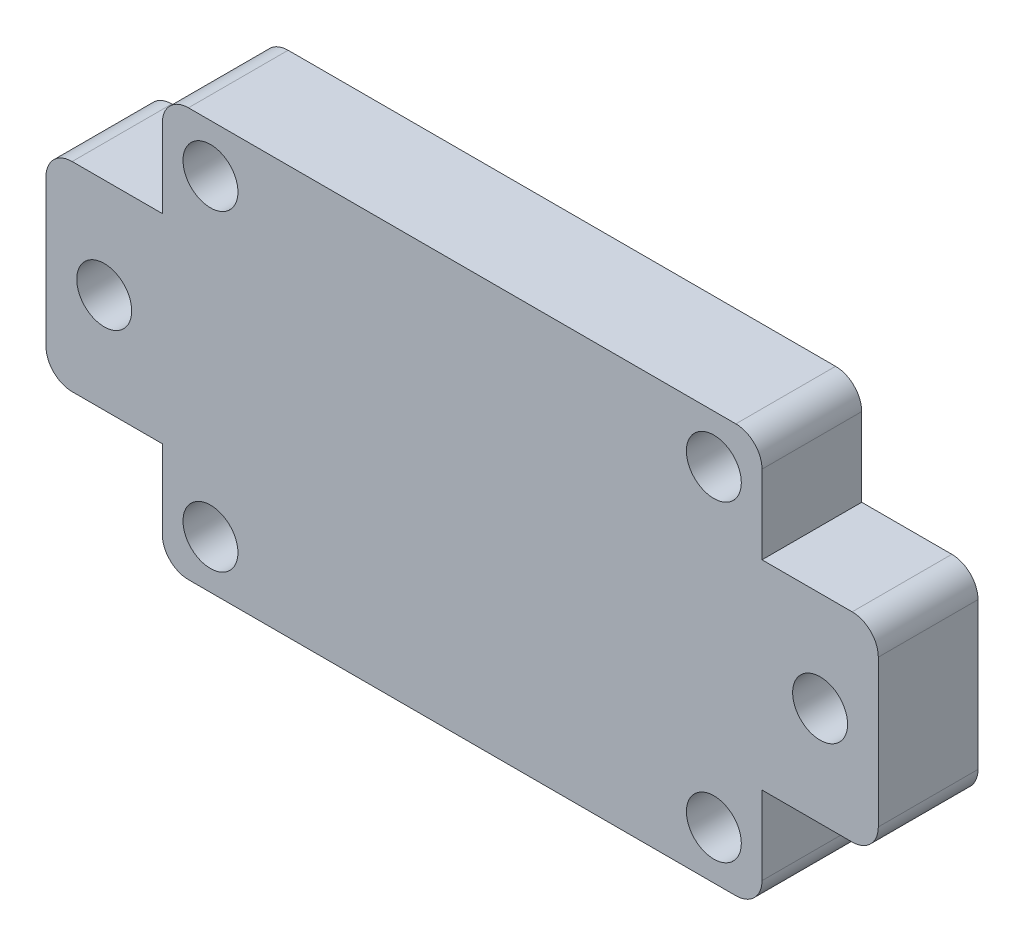
ISO-10303-21;
HEADER;
FILE_DESCRIPTION(('STEP AP214'),'2;1');
FILE_NAME('part.step','',(''),(''),'','','');
FILE_SCHEMA(('AUTOMOTIVE_DESIGN { 1 0 10303 214 1 1 1 1 }'));
ENDSEC;
DATA;
#1=APPLICATION_CONTEXT('core data for automotive mechanical design processes');
#2=APPLICATION_PROTOCOL_DEFINITION('international standard','automotive_design',2000,#1);
#3=PRODUCT_CONTEXT('',#1,'mechanical');
#4=PRODUCT('Part','Part','',(#3));
#5=PRODUCT_RELATED_PRODUCT_CATEGORY('part','',(#4));
#6=PRODUCT_DEFINITION_FORMATION('','',#4);
#7=PRODUCT_DEFINITION_CONTEXT('part definition',#1,'design');
#8=PRODUCT_DEFINITION('design','',#6,#7);
#9=PRODUCT_DEFINITION_SHAPE('','',#8);
#10=(LENGTH_UNIT() NAMED_UNIT(*) SI_UNIT(.MILLI.,.METRE.));
#11=(NAMED_UNIT(*) PLANE_ANGLE_UNIT() SI_UNIT($,.RADIAN.));
#12=(NAMED_UNIT(*) SI_UNIT($,.STERADIAN.) SOLID_ANGLE_UNIT());
#13=UNCERTAINTY_MEASURE_WITH_UNIT(LENGTH_MEASURE(1.E-05),#10,'distance_accuracy_value','');
#14=(GEOMETRIC_REPRESENTATION_CONTEXT(3) GLOBAL_UNCERTAINTY_ASSIGNED_CONTEXT((#13)) GLOBAL_UNIT_ASSIGNED_CONTEXT((#10,
#11,#12)) REPRESENTATION_CONTEXT('',''));
#15=CARTESIAN_POINT('',(0.,0.,0.));
#16=DIRECTION('',(0.,0.,1.));
#17=DIRECTION('',(1.,0.,0.));
#18=AXIS2_PLACEMENT_3D('',#15,#16,#17);
#19=CARTESIAN_POINT('',(138.811,81.915,-8.03148));
#20=DIRECTION('',(-1.,0.,0.));
#21=DIRECTION('',(0.,0.,1.));
#22=AXIS2_PLACEMENT_3D('',#19,#20,#21);
#23=PLANE('',#22);
#24=DIRECTION('',(0.,-1.,0.));
#25=VECTOR('',#24,1.);
#26=CARTESIAN_POINT('',(138.811,81.915,-8.03148));
#27=LINE('',#26,#25);
#28=CARTESIAN_POINT('',(138.811,79.915,-8.03148));
#29=VERTEX_POINT('',#28);
#30=CARTESIAN_POINT('',(138.811,73.914,-8.03148));
#31=VERTEX_POINT('',#30);
#32=EDGE_CURVE('E178',#29,#31,#27,.T.);
#33=ORIENTED_EDGE('',*,*,#32,.F.);
#34=DIRECTION('',(0.,0.,1.));
#35=VECTOR('',#34,1.);
#36=CARTESIAN_POINT('',(138.811,79.915,-8.03148));
#37=LINE('',#36,#35);
#38=CARTESIAN_POINT('',(138.811,79.915,-0.41148));
#39=VERTEX_POINT('',#38);
#40=EDGE_CURVE('E250',#29,#39,#37,.T.);
#41=ORIENTED_EDGE('',*,*,#40,.T.);
#42=DIRECTION('',(0.,-1.,0.));
#43=VECTOR('',#42,1.);
#44=CARTESIAN_POINT('',(138.811,81.915,-0.41148));
#45=LINE('',#44,#43);
#46=CARTESIAN_POINT('',(138.811,73.914,-0.41148));
#47=VERTEX_POINT('',#46);
#48=EDGE_CURVE('E202',#39,#47,#45,.T.);
#49=ORIENTED_EDGE('',*,*,#48,.T.);
#50=DIRECTION('',(0.,0.,1.));
#51=VECTOR('',#50,1.);
#52=CARTESIAN_POINT('',(138.811,73.914,-8.03148));
#53=LINE('',#52,#51);
#54=EDGE_CURVE('E196',#31,#47,#53,.T.);
#55=ORIENTED_EDGE('',*,*,#54,.F.);
#56=EDGE_LOOP('',(#33,#41,#49,#55));
#57=FACE_BOUND('',#56,.T.);
#58=ADVANCED_FACE('F41',(#57),#23,.F.);
#59=CARTESIAN_POINT('',(147.701,73.914,-8.03148));
#60=DIRECTION('',(0.,-1.,0.));
#61=DIRECTION('',(0.,0.,-1.));
#62=AXIS2_PLACEMENT_3D('',#59,#60,#61);
#63=PLANE('',#62);
#64=DIRECTION('',(1.,0.,0.));
#65=VECTOR('',#64,1.);
#66=CARTESIAN_POINT('',(147.701,73.914,-0.41148));
#67=LINE('',#66,#65);
#68=CARTESIAN_POINT('',(145.701,73.914,-0.41148));
#69=VERTEX_POINT('',#68);
#70=EDGE_CURVE('E332',#47,#69,#67,.T.);
#71=ORIENTED_EDGE('',*,*,#70,.T.);
#72=DIRECTION('',(0.,0.,1.));
#73=VECTOR('',#72,1.);
#74=CARTESIAN_POINT('',(145.701,73.914,-8.03148));
#75=LINE('',#74,#73);
#76=CARTESIAN_POINT('',(145.701,73.914,-8.03148));
#77=VERTEX_POINT('',#76);
#78=EDGE_CURVE('E198',#69,#77,#75,.F.);
#79=ORIENTED_EDGE('',*,*,#78,.T.);
#80=DIRECTION('',(1.,0.,0.));
#81=VECTOR('',#80,1.);
#82=CARTESIAN_POINT('',(147.701,73.914,-8.03148));
#83=LINE('',#82,#81);
#84=EDGE_CURVE('E182',#31,#77,#83,.T.);
#85=ORIENTED_EDGE('',*,*,#84,.F.);
#86=ORIENTED_EDGE('',*,*,#54,.T.);
#87=EDGE_LOOP('',(#71,#79,#85,#86));
#88=FACE_BOUND('',#87,.T.);
#89=ADVANCED_FACE('F195',(#88),#63,.F.);
#90=CARTESIAN_POINT('',(147.701,66.294,-8.03148));
#91=DIRECTION('',(-1.,0.,0.));
#92=DIRECTION('',(0.,0.,1.));
#93=AXIS2_PLACEMENT_3D('',#90,#91,#92);
#94=PLANE('',#93);
#95=DIRECTION('',(0.,-1.,0.));
#96=VECTOR('',#95,1.);
#97=CARTESIAN_POINT('',(147.701,66.294,-0.41148));
#98=LINE('',#97,#96);
#99=CARTESIAN_POINT('',(147.701,71.914,-0.41148));
#100=VERTEX_POINT('',#99);
#101=CARTESIAN_POINT('',(147.701,60.674,-0.41148));
#102=VERTEX_POINT('',#101);
#103=EDGE_CURVE('E335',#100,#102,#98,.T.);
#104=ORIENTED_EDGE('',*,*,#103,.T.);
#105=DIRECTION('',(0.,0.,1.));
#106=VECTOR('',#105,1.);
#107=CARTESIAN_POINT('',(147.701,60.674,-8.03148));
#108=LINE('',#107,#106);
#109=CARTESIAN_POINT('',(147.701,60.674,-8.03148));
#110=VERTEX_POINT('',#109);
#111=EDGE_CURVE('E233',#102,#110,#108,.F.);
#112=ORIENTED_EDGE('',*,*,#111,.T.);
#113=DIRECTION('',(0.,-1.,0.));
#114=VECTOR('',#113,1.);
#115=CARTESIAN_POINT('',(147.701,66.294,-8.03148));
#116=LINE('',#115,#114);
#117=CARTESIAN_POINT('',(147.701,71.914,-8.03148));
#118=VERTEX_POINT('',#117);
#119=EDGE_CURVE('E199',#118,#110,#116,.T.);
#120=ORIENTED_EDGE('',*,*,#119,.F.);
#121=DIRECTION('',(0.,0.,1.));
#122=VECTOR('',#121,1.);
#123=CARTESIAN_POINT('',(147.701,71.914,-8.03148));
#124=LINE('',#123,#122);
#125=EDGE_CURVE('E230',#118,#100,#124,.T.);
#126=ORIENTED_EDGE('',*,*,#125,.T.);
#127=EDGE_LOOP('',(#104,#112,#120,#126));
#128=FACE_BOUND('',#127,.T.);
#129=ADVANCED_FACE('F429',(#128),#94,.F.);
#130=CARTESIAN_POINT('',(147.701,58.674,-8.03148));
#131=DIRECTION('',(0.,1.,0.));
#132=DIRECTION('',(0.,0.,1.));
#133=AXIS2_PLACEMENT_3D('',#130,#131,#132);
#134=PLANE('',#133);
#135=DIRECTION('',(-1.,0.,0.));
#136=VECTOR('',#135,1.);
#137=CARTESIAN_POINT('',(147.701,58.674,-8.03148));
#138=LINE('',#137,#136);
#139=CARTESIAN_POINT('',(145.701,58.674,-8.03148));
#140=VERTEX_POINT('',#139);
#141=CARTESIAN_POINT('',(138.811,58.674,-8.03148));
#142=VERTEX_POINT('',#141);
#143=EDGE_CURVE('E357',#140,#142,#138,.T.);
#144=ORIENTED_EDGE('',*,*,#143,.F.);
#145=DIRECTION('',(0.,0.,1.));
#146=VECTOR('',#145,1.);
#147=CARTESIAN_POINT('',(145.701,58.674,-8.03148));
#148=LINE('',#147,#146);
#149=CARTESIAN_POINT('',(145.701,58.674,-0.41148));
#150=VERTEX_POINT('',#149);
#151=EDGE_CURVE('E204',#140,#150,#148,.T.);
#152=ORIENTED_EDGE('',*,*,#151,.T.);
#153=DIRECTION('',(-1.,0.,0.));
#154=VECTOR('',#153,1.);
#155=CARTESIAN_POINT('',(147.701,58.674,-0.41148));
#156=LINE('',#155,#154);
#157=CARTESIAN_POINT('',(138.811,58.674,-0.41148));
#158=VERTEX_POINT('',#157);
#159=EDGE_CURVE('E338',#150,#158,#156,.T.);
#160=ORIENTED_EDGE('',*,*,#159,.T.);
#161=DIRECTION('',(0.,0.,1.));
#162=VECTOR('',#161,1.);
#163=CARTESIAN_POINT('',(138.811,58.674,-8.03148));
#164=LINE('',#163,#162);
#165=EDGE_CURVE('E205',#142,#158,#164,.T.);
#166=ORIENTED_EDGE('',*,*,#165,.F.);
#167=EDGE_LOOP('',(#144,#152,#160,#166));
#168=FACE_BOUND('',#167,.T.);
#169=ADVANCED_FACE('F493',(#168),#134,.F.);
#170=CARTESIAN_POINT('',(138.811,58.674,-8.03148));
#171=DIRECTION('',(-1.,0.,0.));
#172=DIRECTION('',(0.,0.,1.));
#173=AXIS2_PLACEMENT_3D('',#170,#171,#172);
#174=PLANE('',#173);
#175=DIRECTION('',(0.,-1.,0.));
#176=VECTOR('',#175,1.);
#177=CARTESIAN_POINT('',(138.811,58.674,-0.41148));
#178=LINE('',#177,#176);
#179=CARTESIAN_POINT('',(138.811,52.673,-0.41148));
#180=VERTEX_POINT('',#179);
#181=EDGE_CURVE('E296',#158,#180,#178,.T.);
#182=ORIENTED_EDGE('',*,*,#181,.T.);
#183=DIRECTION('',(0.,0.,1.));
#184=VECTOR('',#183,1.);
#185=CARTESIAN_POINT('',(138.811,52.673,-8.03148));
#186=LINE('',#185,#184);
#187=CARTESIAN_POINT('',(138.811,52.673,-8.03148));
#188=VERTEX_POINT('',#187);
#189=EDGE_CURVE('E261',#180,#188,#186,.F.);
#190=ORIENTED_EDGE('',*,*,#189,.T.);
#191=DIRECTION('',(0.,-1.,0.));
#192=VECTOR('',#191,1.);
#193=CARTESIAN_POINT('',(138.811,58.674,-8.03148));
#194=LINE('',#193,#192);
#195=EDGE_CURVE('E353',#142,#188,#194,.T.);
#196=ORIENTED_EDGE('',*,*,#195,.F.);
#197=ORIENTED_EDGE('',*,*,#165,.T.);
#198=EDGE_LOOP('',(#182,#190,#196,#197));
#199=FACE_BOUND('',#198,.T.);
#200=ADVANCED_FACE('F343',(#199),#174,.F.);
#201=CARTESIAN_POINT('',(138.811,50.673,-8.03148));
#202=DIRECTION('',(0.,1.,0.));
#203=DIRECTION('',(0.,0.,1.));
#204=AXIS2_PLACEMENT_3D('',#201,#202,#203);
#205=PLANE('',#204);
#206=DIRECTION('',(-1.,0.,0.));
#207=VECTOR('',#206,1.);
#208=CARTESIAN_POINT('',(138.811,50.673,-8.03148));
#209=LINE('',#208,#207);
#210=CARTESIAN_POINT('',(136.811,50.673,-8.03148));
#211=VERTEX_POINT('',#210);
#212=CARTESIAN_POINT('',(94.964,50.673,-8.03148));
#213=VERTEX_POINT('',#212);
#214=EDGE_CURVE('E323',#211,#213,#209,.T.);
#215=ORIENTED_EDGE('',*,*,#214,.F.);
#216=DIRECTION('',(0.,0.,1.));
#217=VECTOR('',#216,1.);
#218=CARTESIAN_POINT('',(136.811,50.673,-8.03148));
#219=LINE('',#218,#217);
#220=CARTESIAN_POINT('',(136.811,50.673,-0.41148));
#221=VERTEX_POINT('',#220);
#222=EDGE_CURVE('E258',#211,#221,#219,.T.);
#223=ORIENTED_EDGE('',*,*,#222,.T.);
#224=DIRECTION('',(-1.,0.,0.));
#225=VECTOR('',#224,1.);
#226=CARTESIAN_POINT('',(138.811,50.673,-0.41148));
#227=LINE('',#226,#225);
#228=CARTESIAN_POINT('',(94.964,50.673,-0.41148));
#229=VERTEX_POINT('',#228);
#230=EDGE_CURVE('E292',#221,#229,#227,.T.);
#231=ORIENTED_EDGE('',*,*,#230,.T.);
#232=DIRECTION('',(0.,0.,1.));
#233=VECTOR('',#232,1.);
#234=CARTESIAN_POINT('',(94.964,50.673,-8.03148));
#235=LINE('',#234,#233);
#236=EDGE_CURVE('E256',#229,#213,#235,.F.);
#237=ORIENTED_EDGE('',*,*,#236,.T.);
#238=EDGE_LOOP('',(#215,#223,#231,#237));
#239=FACE_BOUND('',#238,.T.);
#240=ADVANCED_FACE('F355',(#239),#205,.F.);
#241=CARTESIAN_POINT('',(92.964,58.674,-8.03148));
#242=DIRECTION('',(1.,0.,0.));
#243=DIRECTION('',(0.,1.,0.));
#244=AXIS2_PLACEMENT_3D('',#241,#242,#243);
#245=PLANE('',#244);
#246=DIRECTION('',(0.,1.,0.));
#247=VECTOR('',#246,1.);
#248=CARTESIAN_POINT('',(92.964,58.674,-8.03148));
#249=LINE('',#248,#247);
#250=CARTESIAN_POINT('',(92.964,52.673,-8.03148));
#251=VERTEX_POINT('',#250);
#252=CARTESIAN_POINT('',(92.964,58.674,-8.03148));
#253=VERTEX_POINT('',#252);
#254=EDGE_CURVE('E281',#251,#253,#249,.T.);
#255=ORIENTED_EDGE('',*,*,#254,.F.);
#256=DIRECTION('',(0.,0.,1.));
#257=VECTOR('',#256,1.);
#258=CARTESIAN_POINT('',(92.964,52.673,-8.03148));
#259=LINE('',#258,#257);
#260=CARTESIAN_POINT('',(92.964,52.673,-0.41148));
#261=VERTEX_POINT('',#260);
#262=EDGE_CURVE('E49',#251,#261,#259,.T.);
#263=ORIENTED_EDGE('',*,*,#262,.T.);
#264=DIRECTION('',(0.,1.,0.));
#265=VECTOR('',#264,1.);
#266=CARTESIAN_POINT('',(92.964,58.674,-0.41148));
#267=LINE('',#266,#265);
#268=CARTESIAN_POINT('',(92.964,58.674,-0.41148));
#269=VERTEX_POINT('',#268);
#270=EDGE_CURVE('E279',#261,#269,#267,.T.);
#271=ORIENTED_EDGE('',*,*,#270,.T.);
#272=DIRECTION('',(0.,0.,1.));
#273=VECTOR('',#272,1.);
#274=CARTESIAN_POINT('',(92.964,58.674,-8.03148));
#275=LINE('',#274,#273);
#276=EDGE_CURVE('E211',#253,#269,#275,.T.);
#277=ORIENTED_EDGE('',*,*,#276,.F.);
#278=EDGE_LOOP('',(#255,#263,#271,#277));
#279=FACE_BOUND('',#278,.T.);
#280=ADVANCED_FACE('F277',(#279),#245,.F.);
#281=CARTESIAN_POINT('',(84.074,58.674,-8.03148));
#282=DIRECTION('',(0.,1.,0.));
#283=DIRECTION('',(0.,0.,1.));
#284=AXIS2_PLACEMENT_3D('',#281,#282,#283);
#285=PLANE('',#284);
#286=DIRECTION('',(-1.,0.,0.));
#287=VECTOR('',#286,1.);
#288=CARTESIAN_POINT('',(84.074,58.674,-0.41148));
#289=LINE('',#288,#287);
#290=CARTESIAN_POINT('',(86.074,58.674,-0.41148));
#291=VERTEX_POINT('',#290);
#292=EDGE_CURVE('E291',#269,#291,#289,.T.);
#293=ORIENTED_EDGE('',*,*,#292,.T.);
#294=DIRECTION('',(0.,0.,1.));
#295=VECTOR('',#294,1.);
#296=CARTESIAN_POINT('',(86.074,58.674,-8.03148));
#297=LINE('',#296,#295);
#298=CARTESIAN_POINT('',(86.074,58.674,-8.03148));
#299=VERTEX_POINT('',#298);
#300=EDGE_CURVE('E11',#291,#299,#297,.F.);
#301=ORIENTED_EDGE('',*,*,#300,.T.);
#302=DIRECTION('',(-1.,0.,0.));
#303=VECTOR('',#302,1.);
#304=CARTESIAN_POINT('',(84.074,58.674,-8.03148));
#305=LINE('',#304,#303);
#306=EDGE_CURVE('E316',#253,#299,#305,.T.);
#307=ORIENTED_EDGE('',*,*,#306,.F.);
#308=ORIENTED_EDGE('',*,*,#276,.T.);
#309=EDGE_LOOP('',(#293,#301,#307,#308));
#310=FACE_BOUND('',#309,.T.);
#311=ADVANCED_FACE('F313',(#310),#285,.F.);
#312=CARTESIAN_POINT('',(84.074,66.294,-8.03148));
#313=DIRECTION('',(1.,0.,0.));
#314=DIRECTION('',(0.,0.,-1.));
#315=AXIS2_PLACEMENT_3D('',#312,#313,#314);
#316=PLANE('',#315);
#317=DIRECTION('',(0.,1.,0.));
#318=VECTOR('',#317,1.);
#319=CARTESIAN_POINT('',(84.074,66.294,-0.41148));
#320=LINE('',#319,#318);
#321=CARTESIAN_POINT('',(84.074,60.674,-0.41148));
#322=VERTEX_POINT('',#321);
#323=CARTESIAN_POINT('',(84.074,71.914,-0.41148));
#324=VERTEX_POINT('',#323);
#325=EDGE_CURVE('E294',#322,#324,#320,.T.);
#326=ORIENTED_EDGE('',*,*,#325,.T.);
#327=DIRECTION('',(0.,0.,1.));
#328=VECTOR('',#327,1.);
#329=CARTESIAN_POINT('',(84.074,71.914,-8.03148));
#330=LINE('',#329,#328);
#331=CARTESIAN_POINT('',(84.074,71.914,-8.03148));
#332=VERTEX_POINT('',#331);
#333=EDGE_CURVE('E271',#324,#332,#330,.F.);
#334=ORIENTED_EDGE('',*,*,#333,.T.);
#335=DIRECTION('',(0.,1.,0.));
#336=VECTOR('',#335,1.);
#337=CARTESIAN_POINT('',(84.074,66.294,-8.03148));
#338=LINE('',#337,#336);
#339=CARTESIAN_POINT('',(84.074,60.674,-8.03148));
#340=VERTEX_POINT('',#339);
#341=EDGE_CURVE('E318',#340,#332,#338,.T.);
#342=ORIENTED_EDGE('',*,*,#341,.F.);
#343=DIRECTION('',(0.,0.,1.));
#344=VECTOR('',#343,1.);
#345=CARTESIAN_POINT('',(84.074,60.674,-8.03148));
#346=LINE('',#345,#344);
#347=EDGE_CURVE('E268',#340,#322,#346,.T.);
#348=ORIENTED_EDGE('',*,*,#347,.T.);
#349=EDGE_LOOP('',(#326,#334,#342,#348));
#350=FACE_BOUND('',#349,.T.);
#351=ADVANCED_FACE('F467',(#350),#316,.F.);
#352=CARTESIAN_POINT('',(84.074,73.914,-8.03148));
#353=DIRECTION('',(0.,-1.,0.));
#354=DIRECTION('',(0.,0.,-1.));
#355=AXIS2_PLACEMENT_3D('',#352,#353,#354);
#356=PLANE('',#355);
#357=DIRECTION('',(1.,0.,0.));
#358=VECTOR('',#357,1.);
#359=CARTESIAN_POINT('',(84.074,73.914,-8.03148));
#360=LINE('',#359,#358);
#361=CARTESIAN_POINT('',(86.074,73.914,-8.03148));
#362=VERTEX_POINT('',#361);
#363=CARTESIAN_POINT('',(92.964,73.914,-8.03148));
#364=VERTEX_POINT('',#363);
#365=EDGE_CURVE('E321',#362,#364,#360,.T.);
#366=ORIENTED_EDGE('',*,*,#365,.F.);
#367=DIRECTION('',(0.,0.,1.));
#368=VECTOR('',#367,1.);
#369=CARTESIAN_POINT('',(86.074,73.914,-8.03148));
#370=LINE('',#369,#368);
#371=CARTESIAN_POINT('',(86.074,73.914,-0.41148));
#372=VERTEX_POINT('',#371);
#373=EDGE_CURVE('E265',#362,#372,#370,.T.);
#374=ORIENTED_EDGE('',*,*,#373,.T.);
#375=DIRECTION('',(1.,0.,0.));
#376=VECTOR('',#375,1.);
#377=CARTESIAN_POINT('',(84.074,73.914,-0.41148));
#378=LINE('',#377,#376);
#379=CARTESIAN_POINT('',(92.964,73.914,-0.41148));
#380=VERTEX_POINT('',#379);
#381=EDGE_CURVE('E302',#372,#380,#378,.T.);
#382=ORIENTED_EDGE('',*,*,#381,.T.);
#383=DIRECTION('',(0.,0.,1.));
#384=VECTOR('',#383,1.);
#385=CARTESIAN_POINT('',(92.964,73.914,-8.03148));
#386=LINE('',#385,#384);
#387=EDGE_CURVE('E308',#364,#380,#386,.T.);
#388=ORIENTED_EDGE('',*,*,#387,.F.);
#389=EDGE_LOOP('',(#366,#374,#382,#388));
#390=FACE_BOUND('',#389,.T.);
#391=ADVANCED_FACE('F474',(#390),#356,.F.);
#392=CARTESIAN_POINT('',(92.964,81.915,-8.03148));
#393=DIRECTION('',(1.,0.,0.));
#394=DIRECTION('',(0.,1.,0.));
#395=AXIS2_PLACEMENT_3D('',#392,#393,#394);
#396=PLANE('',#395);
#397=DIRECTION('',(0.,1.,0.));
#398=VECTOR('',#397,1.);
#399=CARTESIAN_POINT('',(92.964,81.915,-0.41148));
#400=LINE('',#399,#398);
#401=CARTESIAN_POINT('',(92.964,79.915,-0.41148));
#402=VERTEX_POINT('',#401);
#403=EDGE_CURVE('E304',#380,#402,#400,.T.);
#404=ORIENTED_EDGE('',*,*,#403,.T.);
#405=DIRECTION('',(0.,0.,1.));
#406=VECTOR('',#405,1.);
#407=CARTESIAN_POINT('',(92.964,79.915,-8.03148));
#408=LINE('',#407,#406);
#409=CARTESIAN_POINT('',(92.964,79.915,-8.03148));
#410=VERTEX_POINT('',#409);
#411=EDGE_CURVE('E263',#402,#410,#408,.F.);
#412=ORIENTED_EDGE('',*,*,#411,.T.);
#413=DIRECTION('',(0.,1.,0.));
#414=VECTOR('',#413,1.);
#415=CARTESIAN_POINT('',(92.964,81.915,-8.03148));
#416=LINE('',#415,#414);
#417=EDGE_CURVE('E328',#364,#410,#416,.T.);
#418=ORIENTED_EDGE('',*,*,#417,.F.);
#419=ORIENTED_EDGE('',*,*,#387,.T.);
#420=EDGE_LOOP('',(#404,#412,#418,#419));
#421=FACE_BOUND('',#420,.T.);
#422=ADVANCED_FACE('F479',(#421),#396,.F.);
#423=CARTESIAN_POINT('',(138.811,81.915,-8.03148));
#424=DIRECTION('',(0.,-1.,0.));
#425=DIRECTION('',(0.,0.,-1.));
#426=AXIS2_PLACEMENT_3D('',#423,#424,#425);
#427=PLANE('',#426);
#428=DIRECTION('',(1.,0.,0.));
#429=VECTOR('',#428,1.);
#430=CARTESIAN_POINT('',(138.811,81.915,-0.41148));
#431=LINE('',#430,#429);
#432=CARTESIAN_POINT('',(94.964,81.915,-0.41148));
#433=VERTEX_POINT('',#432);
#434=CARTESIAN_POINT('',(136.811,81.915,-0.41148));
#435=VERTEX_POINT('',#434);
#436=EDGE_CURVE('E190',#433,#435,#431,.T.);
#437=ORIENTED_EDGE('',*,*,#436,.T.);
#438=DIRECTION('',(0.,0.,1.));
#439=VECTOR('',#438,1.);
#440=CARTESIAN_POINT('',(136.811,81.915,-8.03148));
#441=LINE('',#440,#439);
#442=CARTESIAN_POINT('',(136.811,81.915,-8.03148));
#443=VERTEX_POINT('',#442);
#444=EDGE_CURVE('E56',#435,#443,#441,.F.);
#445=ORIENTED_EDGE('',*,*,#444,.T.);
#446=DIRECTION('',(1.,0.,0.));
#447=VECTOR('',#446,1.);
#448=CARTESIAN_POINT('',(138.811,81.915,-8.03148));
#449=LINE('',#448,#447);
#450=CARTESIAN_POINT('',(94.964,81.915,-8.03148));
#451=VERTEX_POINT('',#450);
#452=EDGE_CURVE('E310',#451,#443,#449,.T.);
#453=ORIENTED_EDGE('',*,*,#452,.F.);
#454=DIRECTION('',(0.,0.,1.));
#455=VECTOR('',#454,1.);
#456=CARTESIAN_POINT('',(94.964,81.915,-8.03148));
#457=LINE('',#456,#455);
#458=EDGE_CURVE('E252',#451,#433,#457,.T.);
#459=ORIENTED_EDGE('',*,*,#458,.T.);
#460=EDGE_LOOP('',(#437,#445,#453,#459));
#461=FACE_BOUND('',#460,.T.);
#462=ADVANCED_FACE('F483',(#461),#427,.F.);
#463=CARTESIAN_POINT('',(0.,0.,-8.03148));
#464=DIRECTION('',(0.,0.,-1.));
#465=DIRECTION('',(-1.,0.,0.));
#466=AXIS2_PLACEMENT_3D('',#463,#464,#465);
#467=PLANE('',#466);
#468=CARTESIAN_POINT('',(88.524,66.294,-8.03148));
#469=DIRECTION('',(0.,0.,1.));
#470=DIRECTION('',(1.,0.,0.));
#471=AXIS2_PLACEMENT_3D('',#468,#469,#470);
#472=CIRCLE('',#471,2.09999999099999);
#473=CARTESIAN_POINT('',(90.623999991,66.294,-8.03148));
#474=VERTEX_POINT('',#473);
#475=EDGE_CURVE('E333',#474,#474,#472,.T.);
#476=ORIENTED_EDGE('',*,*,#475,.T.);
#477=EDGE_LOOP('',(#476));
#478=FACE_BOUND('',#477,.T.);
#479=CARTESIAN_POINT('',(143.251,66.294,-8.03148));
#480=DIRECTION('',(0.,0.,1.));
#481=DIRECTION('',(1.,0.,0.));
#482=AXIS2_PLACEMENT_3D('',#479,#480,#481);
#483=CIRCLE('',#482,2.09999999999999);
#484=CARTESIAN_POINT('',(145.351,66.294,-8.03148));
#485=VERTEX_POINT('',#484);
#486=EDGE_CURVE('E365',#485,#485,#483,.T.);
#487=ORIENTED_EDGE('',*,*,#486,.T.);
#488=EDGE_LOOP('',(#487));
#489=FACE_BOUND('',#488,.T.);
#490=ORIENTED_EDGE('',*,*,#119,.T.);
#491=CARTESIAN_POINT('',(145.701,60.674,-8.03148));
#492=DIRECTION('',(0.,0.,-1.));
#493=DIRECTION('',(-1.,0.,0.));
#494=AXIS2_PLACEMENT_3D('',#491,#492,#493);
#495=CIRCLE('',#494,2.);
#496=EDGE_CURVE('E247',#110,#140,#495,.T.);
#497=ORIENTED_EDGE('',*,*,#496,.T.);
#498=ORIENTED_EDGE('',*,*,#143,.T.);
#499=ORIENTED_EDGE('',*,*,#195,.T.);
#500=CARTESIAN_POINT('',(136.811,52.673,-8.03148));
#501=DIRECTION('',(0.,0.,-1.));
#502=DIRECTION('',(-1.,0.,0.));
#503=AXIS2_PLACEMENT_3D('',#500,#501,#502);
#504=CIRCLE('',#503,2.);
#505=EDGE_CURVE('E242',#188,#211,#504,.T.);
#506=ORIENTED_EDGE('',*,*,#505,.T.);
#507=ORIENTED_EDGE('',*,*,#214,.T.);
#508=CARTESIAN_POINT('',(94.964,52.673,-8.03148));
#509=DIRECTION('',(0.,0.,-1.));
#510=DIRECTION('',(-1.,0.,0.));
#511=AXIS2_PLACEMENT_3D('',#508,#509,#510);
#512=CIRCLE('',#511,2.);
#513=EDGE_CURVE('E237',#213,#251,#512,.T.);
#514=ORIENTED_EDGE('',*,*,#513,.T.);
#515=ORIENTED_EDGE('',*,*,#254,.T.);
#516=ORIENTED_EDGE('',*,*,#306,.T.);
#517=CARTESIAN_POINT('',(86.074,60.674,-8.03148));
#518=DIRECTION('',(0.,0.,-1.));
#519=DIRECTION('',(-1.,0.,0.));
#520=AXIS2_PLACEMENT_3D('',#517,#518,#519);
#521=CIRCLE('',#520,2.);
#522=EDGE_CURVE('E235',#299,#340,#521,.T.);
#523=ORIENTED_EDGE('',*,*,#522,.T.);
#524=ORIENTED_EDGE('',*,*,#341,.T.);
#525=CARTESIAN_POINT('',(86.074,71.914,-8.03148));
#526=DIRECTION('',(0.,0.,-1.));
#527=DIRECTION('',(-1.,0.,0.));
#528=AXIS2_PLACEMENT_3D('',#525,#526,#527);
#529=CIRCLE('',#528,2.);
#530=EDGE_CURVE('E239',#332,#362,#529,.T.);
#531=ORIENTED_EDGE('',*,*,#530,.T.);
#532=ORIENTED_EDGE('',*,*,#365,.T.);
#533=ORIENTED_EDGE('',*,*,#417,.T.);
#534=CARTESIAN_POINT('',(94.964,79.915,-8.03148));
#535=DIRECTION('',(0.,0.,-1.));
#536=DIRECTION('',(-1.,0.,0.));
#537=AXIS2_PLACEMENT_3D('',#534,#535,#536);
#538=CIRCLE('',#537,2.);
#539=EDGE_CURVE('E63',#410,#451,#538,.T.);
#540=ORIENTED_EDGE('',*,*,#539,.T.);
#541=ORIENTED_EDGE('',*,*,#452,.T.);
#542=CARTESIAN_POINT('',(136.811,79.915,-8.03148));
#543=DIRECTION('',(0.,0.,-1.));
#544=DIRECTION('',(-1.,0.,0.));
#545=AXIS2_PLACEMENT_3D('',#542,#543,#544);
#546=CIRCLE('',#545,2.);
#547=EDGE_CURVE('E185',#443,#29,#546,.T.);
#548=ORIENTED_EDGE('',*,*,#547,.T.);
#549=ORIENTED_EDGE('',*,*,#32,.T.);
#550=ORIENTED_EDGE('',*,*,#84,.T.);
#551=CARTESIAN_POINT('',(145.701,71.914,-8.03148));
#552=DIRECTION('',(0.,0.,-1.));
#553=DIRECTION('',(-1.,0.,0.));
#554=AXIS2_PLACEMENT_3D('',#551,#552,#553);
#555=CIRCLE('',#554,2.);
#556=EDGE_CURVE('E245',#77,#118,#555,.T.);
#557=ORIENTED_EDGE('',*,*,#556,.T.);
#558=EDGE_LOOP('',(#490,#497,#498,#499,#506,#507,#514,#515,#516,#523,#524,#531,#532,#533,#540,
#541,#548,#549,#550,#557));
#559=FACE_BOUND('',#558,.T.);
#560=ADVANCED_FACE('F181',(#478,#489,#559),#467,.T.);
#561=CARTESIAN_POINT('',(0.,0.,-0.41148));
#562=DIRECTION('',(0.,0.,-1.));
#563=DIRECTION('',(-1.,0.,0.));
#564=AXIS2_PLACEMENT_3D('',#561,#562,#563);
#565=PLANE('',#564);
#566=CARTESIAN_POINT('',(135.128,78.232,-0.41148));
#567=DIRECTION('',(0.,0.,1.));
#568=DIRECTION('',(1.,0.,0.));
#569=AXIS2_PLACEMENT_3D('',#566,#567,#568);
#570=CIRCLE('',#569,2.09999999999999);
#571=CARTESIAN_POINT('',(137.228,78.232,-0.41148));
#572=VERTEX_POINT('',#571);
#573=EDGE_CURVE('E383',#572,#572,#570,.T.);
#574=ORIENTED_EDGE('',*,*,#573,.F.);
#575=EDGE_LOOP('',(#574));
#576=FACE_BOUND('',#575,.T.);
#577=CARTESIAN_POINT('',(135.128,54.356,-0.41148));
#578=DIRECTION('',(0.,0.,1.));
#579=DIRECTION('',(1.,0.,0.));
#580=AXIS2_PLACEMENT_3D('',#577,#578,#579);
#581=CIRCLE('',#580,2.09999999999999);
#582=CARTESIAN_POINT('',(137.228,54.356,-0.41148));
#583=VERTEX_POINT('',#582);
#584=EDGE_CURVE('E389',#583,#583,#581,.T.);
#585=ORIENTED_EDGE('',*,*,#584,.F.);
#586=EDGE_LOOP('',(#585));
#587=FACE_BOUND('',#586,.T.);
#588=CARTESIAN_POINT('',(96.647,54.356,-0.41148));
#589=DIRECTION('',(0.,0.,1.));
#590=DIRECTION('',(1.,0.,0.));
#591=AXIS2_PLACEMENT_3D('',#588,#589,#590);
#592=CIRCLE('',#591,2.1);
#593=CARTESIAN_POINT('',(98.747,54.356,-0.41148));
#594=VERTEX_POINT('',#593);
#595=EDGE_CURVE('E377',#594,#594,#592,.T.);
#596=ORIENTED_EDGE('',*,*,#595,.F.);
#597=EDGE_LOOP('',(#596));
#598=FACE_BOUND('',#597,.T.);
#599=CARTESIAN_POINT('',(96.647,78.232,-0.41148));
#600=DIRECTION('',(0.,0.,1.));
#601=DIRECTION('',(1.,0.,0.));
#602=AXIS2_PLACEMENT_3D('',#599,#600,#601);
#603=CIRCLE('',#602,2.1);
#604=CARTESIAN_POINT('',(98.747,78.232,-0.41148));
#605=VERTEX_POINT('',#604);
#606=EDGE_CURVE('E374',#605,#605,#603,.T.);
#607=ORIENTED_EDGE('',*,*,#606,.F.);
#608=EDGE_LOOP('',(#607));
#609=FACE_BOUND('',#608,.T.);
#610=CARTESIAN_POINT('',(88.524,66.294,-0.41148));
#611=DIRECTION('',(0.,0.,1.));
#612=DIRECTION('',(1.,0.,0.));
#613=AXIS2_PLACEMENT_3D('',#610,#611,#612);
#614=CIRCLE('',#613,2.09999999099999);
#615=CARTESIAN_POINT('',(90.623999991,66.294,-0.41148));
#616=VERTEX_POINT('',#615);
#617=EDGE_CURVE('E369',#616,#616,#614,.T.);
#618=ORIENTED_EDGE('',*,*,#617,.F.);
#619=EDGE_LOOP('',(#618));
#620=FACE_BOUND('',#619,.T.);
#621=CARTESIAN_POINT('',(143.251,66.294,-0.41148));
#622=DIRECTION('',(0.,0.,1.));
#623=DIRECTION('',(1.,0.,0.));
#624=AXIS2_PLACEMENT_3D('',#621,#622,#623);
#625=CIRCLE('',#624,2.09999999999999);
#626=CARTESIAN_POINT('',(145.351,66.294,-0.41148));
#627=VERTEX_POINT('',#626);
#628=EDGE_CURVE('E362',#627,#627,#625,.T.);
#629=ORIENTED_EDGE('',*,*,#628,.F.);
#630=EDGE_LOOP('',(#629));
#631=FACE_BOUND('',#630,.T.);
#632=ORIENTED_EDGE('',*,*,#159,.F.);
#633=CARTESIAN_POINT('',(145.701,60.674,-0.41148));
#634=DIRECTION('',(0.,0.,-1.));
#635=DIRECTION('',(-1.,0.,0.));
#636=AXIS2_PLACEMENT_3D('',#633,#634,#635);
#637=CIRCLE('',#636,2.);
#638=EDGE_CURVE('E228',#150,#102,#637,.F.);
#639=ORIENTED_EDGE('',*,*,#638,.T.);
#640=ORIENTED_EDGE('',*,*,#103,.F.);
#641=CARTESIAN_POINT('',(145.701,71.914,-0.41148));
#642=DIRECTION('',(0.,0.,-1.));
#643=DIRECTION('',(-1.,0.,0.));
#644=AXIS2_PLACEMENT_3D('',#641,#642,#643);
#645=CIRCLE('',#644,2.);
#646=EDGE_CURVE('E226',#100,#69,#645,.F.);
#647=ORIENTED_EDGE('',*,*,#646,.T.);
#648=ORIENTED_EDGE('',*,*,#70,.F.);
#649=ORIENTED_EDGE('',*,*,#48,.F.);
#650=CARTESIAN_POINT('',(136.811,79.915,-0.41148));
#651=DIRECTION('',(0.,0.,-1.));
#652=DIRECTION('',(-1.,0.,0.));
#653=AXIS2_PLACEMENT_3D('',#650,#651,#652);
#654=CIRCLE('',#653,2.);
#655=EDGE_CURVE('E224',#39,#435,#654,.F.);
#656=ORIENTED_EDGE('',*,*,#655,.T.);
#657=ORIENTED_EDGE('',*,*,#436,.F.);
#658=CARTESIAN_POINT('',(94.964,79.915,-0.41148));
#659=DIRECTION('',(0.,0.,-1.));
#660=DIRECTION('',(-1.,0.,0.));
#661=AXIS2_PLACEMENT_3D('',#658,#659,#660);
#662=CIRCLE('',#661,2.);
#663=EDGE_CURVE('E220',#433,#402,#662,.F.);
#664=ORIENTED_EDGE('',*,*,#663,.T.);
#665=ORIENTED_EDGE('',*,*,#403,.F.);
#666=ORIENTED_EDGE('',*,*,#381,.F.);
#667=CARTESIAN_POINT('',(86.074,71.914,-0.41148));
#668=DIRECTION('',(0.,0.,-1.));
#669=DIRECTION('',(-1.,0.,0.));
#670=AXIS2_PLACEMENT_3D('',#667,#668,#669);
#671=CIRCLE('',#670,2.);
#672=EDGE_CURVE('E218',#372,#324,#671,.F.);
#673=ORIENTED_EDGE('',*,*,#672,.T.);
#674=ORIENTED_EDGE('',*,*,#325,.F.);
#675=CARTESIAN_POINT('',(86.074,60.674,-0.41148));
#676=DIRECTION('',(0.,0.,-1.));
#677=DIRECTION('',(-1.,0.,0.));
#678=AXIS2_PLACEMENT_3D('',#675,#676,#677);
#679=CIRCLE('',#678,2.);
#680=EDGE_CURVE('E208',#322,#291,#679,.F.);
#681=ORIENTED_EDGE('',*,*,#680,.T.);
#682=ORIENTED_EDGE('',*,*,#292,.F.);
#683=ORIENTED_EDGE('',*,*,#270,.F.);
#684=CARTESIAN_POINT('',(94.964,52.673,-0.41148));
#685=DIRECTION('',(0.,0.,-1.));
#686=DIRECTION('',(-1.,0.,0.));
#687=AXIS2_PLACEMENT_3D('',#684,#685,#686);
#688=CIRCLE('',#687,2.);
#689=EDGE_CURVE('E216',#261,#229,#688,.F.);
#690=ORIENTED_EDGE('',*,*,#689,.T.);
#691=ORIENTED_EDGE('',*,*,#230,.F.);
#692=CARTESIAN_POINT('',(136.811,52.673,-0.41148));
#693=DIRECTION('',(0.,0.,-1.));
#694=DIRECTION('',(-1.,0.,0.));
#695=AXIS2_PLACEMENT_3D('',#692,#693,#694);
#696=CIRCLE('',#695,2.);
#697=EDGE_CURVE('E222',#221,#180,#696,.F.);
#698=ORIENTED_EDGE('',*,*,#697,.T.);
#699=ORIENTED_EDGE('',*,*,#181,.F.);
#700=EDGE_LOOP('',(#632,#639,#640,#647,#648,#649,#656,#657,#664,#665,#666,#673,#674,#681,#682,
#683,#690,#691,#698,#699));
#701=FACE_BOUND('',#700,.T.);
#702=ADVANCED_FACE('F287',(#576,#587,#598,#609,#620,#631,#701),#565,.F.);
#703=CARTESIAN_POINT('',(143.251,66.294,-8.03148));
#704=DIRECTION('',(0.,0.,1.));
#705=DIRECTION('',(1.,0.,0.));
#706=AXIS2_PLACEMENT_3D('',#703,#704,#705);
#707=CYLINDRICAL_SURFACE('',#706,2.09999999999999);
#708=CARTESIAN_POINT('',(145.351,66.294,-8.03148));
#709=CARTESIAN_POINT('',(145.351,66.294,-7.952105));
#710=CARTESIAN_POINT('',(145.351,66.294,-7.87273));
#711=CARTESIAN_POINT('',(145.351,66.294,-7.71398));
#712=CARTESIAN_POINT('',(145.351,66.294,-7.634605));
#713=CARTESIAN_POINT('',(145.351,66.294,-7.475855));
#714=CARTESIAN_POINT('',(145.351,66.294,-7.39648));
#715=CARTESIAN_POINT('',(145.351,66.294,-7.23773));
#716=CARTESIAN_POINT('',(145.351,66.294,-7.158355));
#717=CARTESIAN_POINT('',(145.351,66.294,-6.999605));
#718=CARTESIAN_POINT('',(145.351,66.294,-6.92023));
#719=CARTESIAN_POINT('',(145.351,66.294,-6.76148));
#720=CARTESIAN_POINT('',(145.351,66.294,-6.682105));
#721=CARTESIAN_POINT('',(145.351,66.294,-6.523355));
#722=CARTESIAN_POINT('',(145.351,66.294,-6.44398));
#723=CARTESIAN_POINT('',(145.351,66.294,-6.28523));
#724=CARTESIAN_POINT('',(145.351,66.294,-6.205855));
#725=CARTESIAN_POINT('',(145.351,66.294,-6.047105));
#726=CARTESIAN_POINT('',(145.351,66.294,-5.96773));
#727=CARTESIAN_POINT('',(145.351,66.294,-5.80898));
#728=CARTESIAN_POINT('',(145.351,66.294,-5.729605));
#729=CARTESIAN_POINT('',(145.351,66.294,-5.570855));
#730=CARTESIAN_POINT('',(145.351,66.294,-5.49148));
#731=CARTESIAN_POINT('',(145.351,66.294,-5.33273));
#732=CARTESIAN_POINT('',(145.351,66.294,-5.253355));
#733=CARTESIAN_POINT('',(145.351,66.294,-5.094605));
#734=CARTESIAN_POINT('',(145.351,66.294,-5.01523));
#735=CARTESIAN_POINT('',(145.351,66.294,-4.85648));
#736=CARTESIAN_POINT('',(145.351,66.294,-4.777105));
#737=CARTESIAN_POINT('',(145.351,66.294,-4.618355));
#738=CARTESIAN_POINT('',(145.351,66.294,-4.53898));
#739=CARTESIAN_POINT('',(145.351,66.294,-4.38023));
#740=CARTESIAN_POINT('',(145.351,66.294,-4.300855));
#741=CARTESIAN_POINT('',(145.351,66.294,-4.142105));
#742=CARTESIAN_POINT('',(145.351,66.294,-4.06273));
#743=CARTESIAN_POINT('',(145.351,66.294,-3.90398));
#744=CARTESIAN_POINT('',(145.351,66.294,-3.824605));
#745=CARTESIAN_POINT('',(145.351,66.294,-3.665855));
#746=CARTESIAN_POINT('',(145.351,66.294,-3.58648));
#747=CARTESIAN_POINT('',(145.351,66.294,-3.42773));
#748=CARTESIAN_POINT('',(145.351,66.294,-3.348355));
#749=CARTESIAN_POINT('',(145.351,66.294,-3.189605));
#750=CARTESIAN_POINT('',(145.351,66.294,-3.11023));
#751=CARTESIAN_POINT('',(145.351,66.294,-2.95148));
#752=CARTESIAN_POINT('',(145.351,66.294,-2.872105));
#753=CARTESIAN_POINT('',(145.351,66.294,-2.713355));
#754=CARTESIAN_POINT('',(145.351,66.294,-2.63398));
#755=CARTESIAN_POINT('',(145.351,66.294,-2.47523));
#756=CARTESIAN_POINT('',(145.351,66.294,-2.395855));
#757=CARTESIAN_POINT('',(145.351,66.294,-2.237105));
#758=CARTESIAN_POINT('',(145.351,66.294,-2.15773));
#759=CARTESIAN_POINT('',(145.351,66.294,-1.99898));
#760=CARTESIAN_POINT('',(145.351,66.294,-1.919605));
#761=CARTESIAN_POINT('',(145.351,66.294,-1.760855));
#762=CARTESIAN_POINT('',(145.351,66.294,-1.68148));
#763=CARTESIAN_POINT('',(145.351,66.294,-1.52273));
#764=CARTESIAN_POINT('',(145.351,66.294,-1.443355));
#765=CARTESIAN_POINT('',(145.351,66.294,-1.284605));
#766=CARTESIAN_POINT('',(145.351,66.294,-1.20523));
#767=CARTESIAN_POINT('',(145.351,66.294,-1.04648));
#768=CARTESIAN_POINT('',(145.351,66.294,-0.967105));
#769=CARTESIAN_POINT('',(145.351,66.294,-0.808354999999999));
#770=CARTESIAN_POINT('',(145.351,66.294,-0.728979999999999));
#771=CARTESIAN_POINT('',(145.351,66.294,-0.570229999999999));
#772=CARTESIAN_POINT('',(145.351,66.294,-0.490855));
#773=CARTESIAN_POINT('',(145.351,66.294,-0.41148));
#774=B_SPLINE_CURVE_WITH_KNOTS('',3,(#708,#709,#710,#711,#712,#713,#714,#715,#716,#717,#718,
#719,#720,#721,#722,#723,#724,#725,#726,#727,#728,#729,#730,#731,#732,#733,#734,#735,#736,#737,
#738,#739,#740,#741,#742,#743,#744,#745,#746,#747,#748,#749,#750,#751,#752,#753,#754,#755,#756,
#757,#758,#759,#760,#761,#762,#763,#764,#765,#766,#767,#768,#769,#770,#771,#772,#773),
.UNSPECIFIED.,.F.,.F.,(4,2,2,2,2,2,2,2,2,2,2,2,2,2,2,2,2,2,2,2,2,2,2,2,2,2,2,2,2,2,2,2,4),(0.,
0.238125,0.476250000000001,0.714375000000001,0.952500000000001,1.190625,1.42875,1.666875,1.905,
2.143125,2.38125,2.619375,2.8575,3.095625,3.33375,3.571875,3.81,4.048125,4.28625,4.524375,
4.7625,5.000625,5.23875,5.476875,5.715,5.953125,6.19125,6.429375,6.6675,6.905625,7.14375,
7.381875,7.62),.UNSPECIFIED.);
#775=EDGE_CURVE('BSEAM402',#485,#627,#774,.T.);
#776=ORIENTED_EDGE('',*,*,#486,.F.);
#777=ORIENTED_EDGE('',*,*,#628,.T.);
#778=ORIENTED_EDGE('',*,*,#775,.T.);
#779=ORIENTED_EDGE('',*,*,#775,.F.);
#780=EDGE_LOOP('',(#776,#778,#777,#779));
#781=FACE_BOUND('',#780,.T.);
#782=ADVANCED_FACE('F402',(#781),#707,.F.);
#783=CARTESIAN_POINT('',(88.524,66.294,-8.03148));
#784=DIRECTION('',(0.,0.,1.));
#785=DIRECTION('',(1.,0.,0.));
#786=AXIS2_PLACEMENT_3D('',#783,#784,#785);
#787=CYLINDRICAL_SURFACE('',#786,2.09999999099999);
#788=CARTESIAN_POINT('',(90.623999991,66.294,-8.03148));
#789=CARTESIAN_POINT('',(90.623999991,66.294,-7.952105));
#790=CARTESIAN_POINT('',(90.623999991,66.294,-7.87273));
#791=CARTESIAN_POINT('',(90.623999991,66.294,-7.71398));
#792=CARTESIAN_POINT('',(90.623999991,66.294,-7.634605));
#793=CARTESIAN_POINT('',(90.623999991,66.294,-7.475855));
#794=CARTESIAN_POINT('',(90.623999991,66.294,-7.39648));
#795=CARTESIAN_POINT('',(90.623999991,66.294,-7.23773));
#796=CARTESIAN_POINT('',(90.623999991,66.294,-7.158355));
#797=CARTESIAN_POINT('',(90.623999991,66.294,-6.999605));
#798=CARTESIAN_POINT('',(90.623999991,66.294,-6.92023));
#799=CARTESIAN_POINT('',(90.623999991,66.294,-6.76148));
#800=CARTESIAN_POINT('',(90.623999991,66.294,-6.682105));
#801=CARTESIAN_POINT('',(90.623999991,66.294,-6.523355));
#802=CARTESIAN_POINT('',(90.623999991,66.294,-6.44398));
#803=CARTESIAN_POINT('',(90.623999991,66.294,-6.28523));
#804=CARTESIAN_POINT('',(90.623999991,66.294,-6.205855));
#805=CARTESIAN_POINT('',(90.623999991,66.294,-6.047105));
#806=CARTESIAN_POINT('',(90.623999991,66.294,-5.96773));
#807=CARTESIAN_POINT('',(90.623999991,66.294,-5.80898));
#808=CARTESIAN_POINT('',(90.623999991,66.294,-5.729605));
#809=CARTESIAN_POINT('',(90.623999991,66.294,-5.570855));
#810=CARTESIAN_POINT('',(90.623999991,66.294,-5.49148));
#811=CARTESIAN_POINT('',(90.623999991,66.294,-5.33273));
#812=CARTESIAN_POINT('',(90.623999991,66.294,-5.253355));
#813=CARTESIAN_POINT('',(90.623999991,66.294,-5.094605));
#814=CARTESIAN_POINT('',(90.623999991,66.294,-5.01523));
#815=CARTESIAN_POINT('',(90.623999991,66.294,-4.85648));
#816=CARTESIAN_POINT('',(90.623999991,66.294,-4.777105));
#817=CARTESIAN_POINT('',(90.623999991,66.294,-4.618355));
#818=CARTESIAN_POINT('',(90.623999991,66.294,-4.53898));
#819=CARTESIAN_POINT('',(90.623999991,66.294,-4.38023));
#820=CARTESIAN_POINT('',(90.623999991,66.294,-4.300855));
#821=CARTESIAN_POINT('',(90.623999991,66.294,-4.142105));
#822=CARTESIAN_POINT('',(90.623999991,66.294,-4.06273));
#823=CARTESIAN_POINT('',(90.623999991,66.294,-3.90398));
#824=CARTESIAN_POINT('',(90.623999991,66.294,-3.824605));
#825=CARTESIAN_POINT('',(90.623999991,66.294,-3.665855));
#826=CARTESIAN_POINT('',(90.623999991,66.294,-3.58648));
#827=CARTESIAN_POINT('',(90.623999991,66.294,-3.42773));
#828=CARTESIAN_POINT('',(90.623999991,66.294,-3.348355));
#829=CARTESIAN_POINT('',(90.623999991,66.294,-3.189605));
#830=CARTESIAN_POINT('',(90.623999991,66.294,-3.11023));
#831=CARTESIAN_POINT('',(90.623999991,66.294,-2.95148));
#832=CARTESIAN_POINT('',(90.623999991,66.294,-2.872105));
#833=CARTESIAN_POINT('',(90.623999991,66.294,-2.713355));
#834=CARTESIAN_POINT('',(90.623999991,66.294,-2.63398));
#835=CARTESIAN_POINT('',(90.623999991,66.294,-2.47523));
#836=CARTESIAN_POINT('',(90.623999991,66.294,-2.395855));
#837=CARTESIAN_POINT('',(90.623999991,66.294,-2.237105));
#838=CARTESIAN_POINT('',(90.623999991,66.294,-2.15773));
#839=CARTESIAN_POINT('',(90.623999991,66.294,-1.99898));
#840=CARTESIAN_POINT('',(90.623999991,66.294,-1.919605));
#841=CARTESIAN_POINT('',(90.623999991,66.294,-1.760855));
#842=CARTESIAN_POINT('',(90.623999991,66.294,-1.68148));
#843=CARTESIAN_POINT('',(90.623999991,66.294,-1.52273));
#844=CARTESIAN_POINT('',(90.623999991,66.294,-1.443355));
#845=CARTESIAN_POINT('',(90.623999991,66.294,-1.284605));
#846=CARTESIAN_POINT('',(90.623999991,66.294,-1.20523));
#847=CARTESIAN_POINT('',(90.623999991,66.294,-1.04648));
#848=CARTESIAN_POINT('',(90.623999991,66.294,-0.967105));
#849=CARTESIAN_POINT('',(90.623999991,66.294,-0.808354999999999));
#850=CARTESIAN_POINT('',(90.623999991,66.294,-0.728979999999999));
#851=CARTESIAN_POINT('',(90.623999991,66.294,-0.570229999999999));
#852=CARTESIAN_POINT('',(90.623999991,66.294,-0.490855));
#853=CARTESIAN_POINT('',(90.623999991,66.294,-0.41148));
#854=B_SPLINE_CURVE_WITH_KNOTS('',3,(#788,#789,#790,#791,#792,#793,#794,#795,#796,#797,#798,
#799,#800,#801,#802,#803,#804,#805,#806,#807,#808,#809,#810,#811,#812,#813,#814,#815,#816,#817,
#818,#819,#820,#821,#822,#823,#824,#825,#826,#827,#828,#829,#830,#831,#832,#833,#834,#835,#836,
#837,#838,#839,#840,#841,#842,#843,#844,#845,#846,#847,#848,#849,#850,#851,#852,#853),
.UNSPECIFIED.,.F.,.F.,(4,2,2,2,2,2,2,2,2,2,2,2,2,2,2,2,2,2,2,2,2,2,2,2,2,2,2,2,2,2,2,2,4),(0.,
0.238125,0.476250000000001,0.714375000000001,0.952500000000001,1.190625,1.42875,1.666875,1.905,
2.143125,2.38125,2.619375,2.8575,3.095625,3.33375,3.571875,3.81,4.048125,4.28625,4.524375,
4.7625,5.000625,5.23875,5.476875,5.715,5.953125,6.19125,6.429375,6.6675,6.905625,7.14375,
7.381875,7.62),.UNSPECIFIED.);
#855=EDGE_CURVE('BSEAM412',#474,#616,#854,.T.);
#856=ORIENTED_EDGE('',*,*,#475,.F.);
#857=ORIENTED_EDGE('',*,*,#617,.T.);
#858=ORIENTED_EDGE('',*,*,#855,.T.);
#859=ORIENTED_EDGE('',*,*,#855,.F.);
#860=EDGE_LOOP('',(#856,#858,#857,#859));
#861=FACE_BOUND('',#860,.T.);
#862=ADVANCED_FACE('F412',(#861),#787,.F.);
#863=CARTESIAN_POINT('',(96.647,78.232,-6.76148));
#864=DIRECTION('',(0.,0.,1.));
#865=DIRECTION('',(1.,0.,0.));
#866=AXIS2_PLACEMENT_3D('',#863,#864,#865);
#867=CYLINDRICAL_SURFACE('',#866,2.1);
#868=CARTESIAN_POINT('',(96.647,78.232,-6.76148));
#869=DIRECTION('',(0.,0.,1.));
#870=DIRECTION('',(1.,0.,0.));
#871=AXIS2_PLACEMENT_3D('',#868,#869,#870);
#872=CIRCLE('',#871,2.1);
#873=CARTESIAN_POINT('',(98.747,78.232,-6.76148));
#874=VERTEX_POINT('',#873);
#875=EDGE_CURVE('E366',#874,#874,#872,.T.);
#876=ORIENTED_EDGE('',*,*,#875,.F.);
#877=EDGE_LOOP('',(#876));
#878=FACE_BOUND('',#877,.T.);
#879=ORIENTED_EDGE('',*,*,#606,.T.);
#880=EDGE_LOOP('',(#879));
#881=FACE_BOUND('',#880,.T.);
#882=ADVANCED_FACE('F418',(#878,#881),#867,.F.);
#883=CARTESIAN_POINT('',(0.,0.,-6.76148));
#884=DIRECTION('',(0.,0.,1.));
#885=DIRECTION('',(1.,0.,0.));
#886=AXIS2_PLACEMENT_3D('',#883,#884,#885);
#887=PLANE('',#886);
#888=ORIENTED_EDGE('',*,*,#875,.T.);
#889=EDGE_LOOP('',(#888));
#890=FACE_BOUND('',#889,.T.);
#891=ADVANCED_FACE('F624',(#890),#887,.T.);
#892=CARTESIAN_POINT('',(96.647,54.356,-6.76148));
#893=DIRECTION('',(0.,0.,1.));
#894=DIRECTION('',(1.,0.,0.));
#895=AXIS2_PLACEMENT_3D('',#892,#893,#894);
#896=CYLINDRICAL_SURFACE('',#895,2.1);
#897=CARTESIAN_POINT('',(96.647,54.356,-6.76148));
#898=DIRECTION('',(0.,0.,1.));
#899=DIRECTION('',(1.,0.,0.));
#900=AXIS2_PLACEMENT_3D('',#897,#898,#899);
#901=CIRCLE('',#900,2.1);
#902=CARTESIAN_POINT('',(98.747,54.356,-6.76148));
#903=VERTEX_POINT('',#902);
#904=EDGE_CURVE('E392',#903,#903,#901,.T.);
#905=ORIENTED_EDGE('',*,*,#904,.F.);
#906=EDGE_LOOP('',(#905));
#907=FACE_BOUND('',#906,.T.);
#908=ORIENTED_EDGE('',*,*,#595,.T.);
#909=EDGE_LOOP('',(#908));
#910=FACE_BOUND('',#909,.T.);
#911=ADVANCED_FACE('F398',(#907,#910),#896,.F.);
#912=CARTESIAN_POINT('',(96.647,54.356,-6.76148));
#913=DIRECTION('',(0.,0.,1.));
#914=DIRECTION('',(1.,0.,0.));
#915=AXIS2_PLACEMENT_3D('',#912,#913,#914);
#916=PLANE('',#915);
#917=ORIENTED_EDGE('',*,*,#904,.T.);
#918=EDGE_LOOP('',(#917));
#919=FACE_BOUND('',#918,.T.);
#920=ADVANCED_FACE('F607',(#919),#916,.T.);
#921=CARTESIAN_POINT('',(135.128,54.356,-6.76148));
#922=DIRECTION('',(0.,0.,1.));
#923=DIRECTION('',(1.,0.,0.));
#924=AXIS2_PLACEMENT_3D('',#921,#922,#923);
#925=CYLINDRICAL_SURFACE('',#924,2.09999999999999);
#926=CARTESIAN_POINT('',(135.128,54.356,-6.76148));
#927=DIRECTION('',(0.,0.,1.));
#928=DIRECTION('',(1.,0.,0.));
#929=AXIS2_PLACEMENT_3D('',#926,#927,#928);
#930=CIRCLE('',#929,2.09999999999999);
#931=CARTESIAN_POINT('',(137.228,54.356,-6.76148));
#932=VERTEX_POINT('',#931);
#933=EDGE_CURVE('E386',#932,#932,#930,.T.);
#934=ORIENTED_EDGE('',*,*,#933,.F.);
#935=EDGE_LOOP('',(#934));
#936=FACE_BOUND('',#935,.T.);
#937=ORIENTED_EDGE('',*,*,#584,.T.);
#938=EDGE_LOOP('',(#937));
#939=FACE_BOUND('',#938,.T.);
#940=ADVANCED_FACE('F598',(#936,#939),#925,.F.);
#941=CARTESIAN_POINT('',(135.128,54.356,-6.76148));
#942=DIRECTION('',(0.,0.,1.));
#943=DIRECTION('',(1.,0.,0.));
#944=AXIS2_PLACEMENT_3D('',#941,#942,#943);
#945=PLANE('',#944);
#946=ORIENTED_EDGE('',*,*,#933,.T.);
#947=EDGE_LOOP('',(#946));
#948=FACE_BOUND('',#947,.T.);
#949=ADVANCED_FACE('F589',(#948),#945,.T.);
#950=CARTESIAN_POINT('',(135.128,78.232,-6.76148));
#951=DIRECTION('',(0.,0.,1.));
#952=DIRECTION('',(1.,0.,0.));
#953=AXIS2_PLACEMENT_3D('',#950,#951,#952);
#954=CYLINDRICAL_SURFACE('',#953,2.09999999999999);
#955=CARTESIAN_POINT('',(135.128,78.232,-6.76148));
#956=DIRECTION('',(0.,0.,1.));
#957=DIRECTION('',(1.,0.,0.));
#958=AXIS2_PLACEMENT_3D('',#955,#956,#957);
#959=CIRCLE('',#958,2.09999999999999);
#960=CARTESIAN_POINT('',(137.228,78.232,-6.76148));
#961=VERTEX_POINT('',#960);
#962=EDGE_CURVE('E380',#961,#961,#959,.T.);
#963=ORIENTED_EDGE('',*,*,#962,.F.);
#964=EDGE_LOOP('',(#963));
#965=FACE_BOUND('',#964,.T.);
#966=ORIENTED_EDGE('',*,*,#573,.T.);
#967=EDGE_LOOP('',(#966));
#968=FACE_BOUND('',#967,.T.);
#969=ADVANCED_FACE('F580',(#965,#968),#954,.F.);
#970=CARTESIAN_POINT('',(135.128,78.232,-6.76148));
#971=DIRECTION('',(0.,0.,1.));
#972=DIRECTION('',(1.,0.,0.));
#973=AXIS2_PLACEMENT_3D('',#970,#971,#972);
#974=PLANE('',#973);
#975=ORIENTED_EDGE('',*,*,#962,.T.);
#976=EDGE_LOOP('',(#975));
#977=FACE_BOUND('',#976,.T.);
#978=ADVANCED_FACE('F437',(#977),#974,.T.);
#979=CARTESIAN_POINT('',(145.701,60.674,-8.03148));
#980=DIRECTION('',(0.,0.,1.));
#981=DIRECTION('',(1.,0.,0.));
#982=AXIS2_PLACEMENT_3D('',#979,#980,#981);
#983=CYLINDRICAL_SURFACE('',#982,2.);
#984=ORIENTED_EDGE('',*,*,#496,.F.);
#985=ORIENTED_EDGE('',*,*,#111,.F.);
#986=ORIENTED_EDGE('',*,*,#638,.F.);
#987=ORIENTED_EDGE('',*,*,#151,.F.);
#988=EDGE_LOOP('',(#984,#985,#986,#987));
#989=FACE_BOUND('',#988,.T.);
#990=ADVANCED_FACE('F433',(#989),#983,.T.);
#991=CARTESIAN_POINT('',(145.701,71.914,-8.03148));
#992=DIRECTION('',(0.,0.,1.));
#993=DIRECTION('',(1.,0.,0.));
#994=AXIS2_PLACEMENT_3D('',#991,#992,#993);
#995=CYLINDRICAL_SURFACE('',#994,2.);
#996=ORIENTED_EDGE('',*,*,#556,.F.);
#997=ORIENTED_EDGE('',*,*,#78,.F.);
#998=ORIENTED_EDGE('',*,*,#646,.F.);
#999=ORIENTED_EDGE('',*,*,#125,.F.);
#1000=EDGE_LOOP('',(#996,#997,#998,#999));
#1001=FACE_BOUND('',#1000,.T.);
#1002=ADVANCED_FACE('F436',(#1001),#995,.T.);
#1003=CARTESIAN_POINT('',(136.811,79.915,-8.03148));
#1004=DIRECTION('',(0.,0.,1.));
#1005=DIRECTION('',(1.,0.,0.));
#1006=AXIS2_PLACEMENT_3D('',#1003,#1004,#1005);
#1007=CYLINDRICAL_SURFACE('',#1006,2.);
#1008=ORIENTED_EDGE('',*,*,#547,.F.);
#1009=ORIENTED_EDGE('',*,*,#444,.F.);
#1010=ORIENTED_EDGE('',*,*,#655,.F.);
#1011=ORIENTED_EDGE('',*,*,#40,.F.);
#1012=EDGE_LOOP('',(#1008,#1009,#1010,#1011));
#1013=FACE_BOUND('',#1012,.T.);
#1014=ADVANCED_FACE('F441',(#1013),#1007,.T.);
#1015=CARTESIAN_POINT('',(136.811,52.673,-8.03148));
#1016=DIRECTION('',(0.,0.,1.));
#1017=DIRECTION('',(1.,0.,0.));
#1018=AXIS2_PLACEMENT_3D('',#1015,#1016,#1017);
#1019=CYLINDRICAL_SURFACE('',#1018,2.);
#1020=ORIENTED_EDGE('',*,*,#505,.F.);
#1021=ORIENTED_EDGE('',*,*,#189,.F.);
#1022=ORIENTED_EDGE('',*,*,#697,.F.);
#1023=ORIENTED_EDGE('',*,*,#222,.F.);
#1024=EDGE_LOOP('',(#1020,#1021,#1022,#1023));
#1025=FACE_BOUND('',#1024,.T.);
#1026=ADVANCED_FACE('F349',(#1025),#1019,.T.);
#1027=CARTESIAN_POINT('',(94.964,79.915,-8.03148));
#1028=DIRECTION('',(0.,0.,1.));
#1029=DIRECTION('',(1.,0.,0.));
#1030=AXIS2_PLACEMENT_3D('',#1027,#1028,#1029);
#1031=CYLINDRICAL_SURFACE('',#1030,2.);
#1032=ORIENTED_EDGE('',*,*,#539,.F.);
#1033=ORIENTED_EDGE('',*,*,#411,.F.);
#1034=ORIENTED_EDGE('',*,*,#663,.F.);
#1035=ORIENTED_EDGE('',*,*,#458,.F.);
#1036=EDGE_LOOP('',(#1032,#1033,#1034,#1035));
#1037=FACE_BOUND('',#1036,.T.);
#1038=ADVANCED_FACE('F448',(#1037),#1031,.T.);
#1039=CARTESIAN_POINT('',(86.074,71.914,-8.03148));
#1040=DIRECTION('',(0.,0.,1.));
#1041=DIRECTION('',(1.,0.,0.));
#1042=AXIS2_PLACEMENT_3D('',#1039,#1040,#1041);
#1043=CYLINDRICAL_SURFACE('',#1042,2.);
#1044=ORIENTED_EDGE('',*,*,#530,.F.);
#1045=ORIENTED_EDGE('',*,*,#333,.F.);
#1046=ORIENTED_EDGE('',*,*,#672,.F.);
#1047=ORIENTED_EDGE('',*,*,#373,.F.);
#1048=EDGE_LOOP('',(#1044,#1045,#1046,#1047));
#1049=FACE_BOUND('',#1048,.T.);
#1050=ADVANCED_FACE('F451',(#1049),#1043,.T.);
#1051=CARTESIAN_POINT('',(94.964,52.673,-8.03148));
#1052=DIRECTION('',(0.,0.,1.));
#1053=DIRECTION('',(1.,0.,0.));
#1054=AXIS2_PLACEMENT_3D('',#1051,#1052,#1053);
#1055=CYLINDRICAL_SURFACE('',#1054,2.);
#1056=ORIENTED_EDGE('',*,*,#513,.F.);
#1057=ORIENTED_EDGE('',*,*,#236,.F.);
#1058=ORIENTED_EDGE('',*,*,#689,.F.);
#1059=ORIENTED_EDGE('',*,*,#262,.F.);
#1060=EDGE_LOOP('',(#1056,#1057,#1058,#1059));
#1061=FACE_BOUND('',#1060,.T.);
#1062=ADVANCED_FACE('F454',(#1061),#1055,.T.);
#1063=CARTESIAN_POINT('',(86.074,60.674,-8.03148));
#1064=DIRECTION('',(0.,0.,1.));
#1065=DIRECTION('',(1.,0.,0.));
#1066=AXIS2_PLACEMENT_3D('',#1063,#1064,#1065);
#1067=CYLINDRICAL_SURFACE('',#1066,2.);
#1068=ORIENTED_EDGE('',*,*,#522,.F.);
#1069=ORIENTED_EDGE('',*,*,#300,.F.);
#1070=ORIENTED_EDGE('',*,*,#680,.F.);
#1071=ORIENTED_EDGE('',*,*,#347,.F.);
#1072=EDGE_LOOP('',(#1068,#1069,#1070,#1071));
#1073=FACE_BOUND('',#1072,.T.);
#1074=ADVANCED_FACE('F43',(#1073),#1067,.T.);
#1075=CLOSED_SHELL('',(#58,#89,#129,#169,#200,#240,#280,#311,#351,#391,#422,#462,#560,#702,#782,
#862,#882,#891,#911,#920,#940,#949,#969,#978,#990,#1002,#1014,#1026,#1038,#1050,#1062,#1074));
#1076=MANIFOLD_SOLID_BREP('B2',#1075);
#1077=ADVANCED_BREP_SHAPE_REPRESENTATION('',(#18,#1076),#14);
#1078=SHAPE_DEFINITION_REPRESENTATION(#9,#1077);
ENDSEC;
END-ISO-10303-21;
